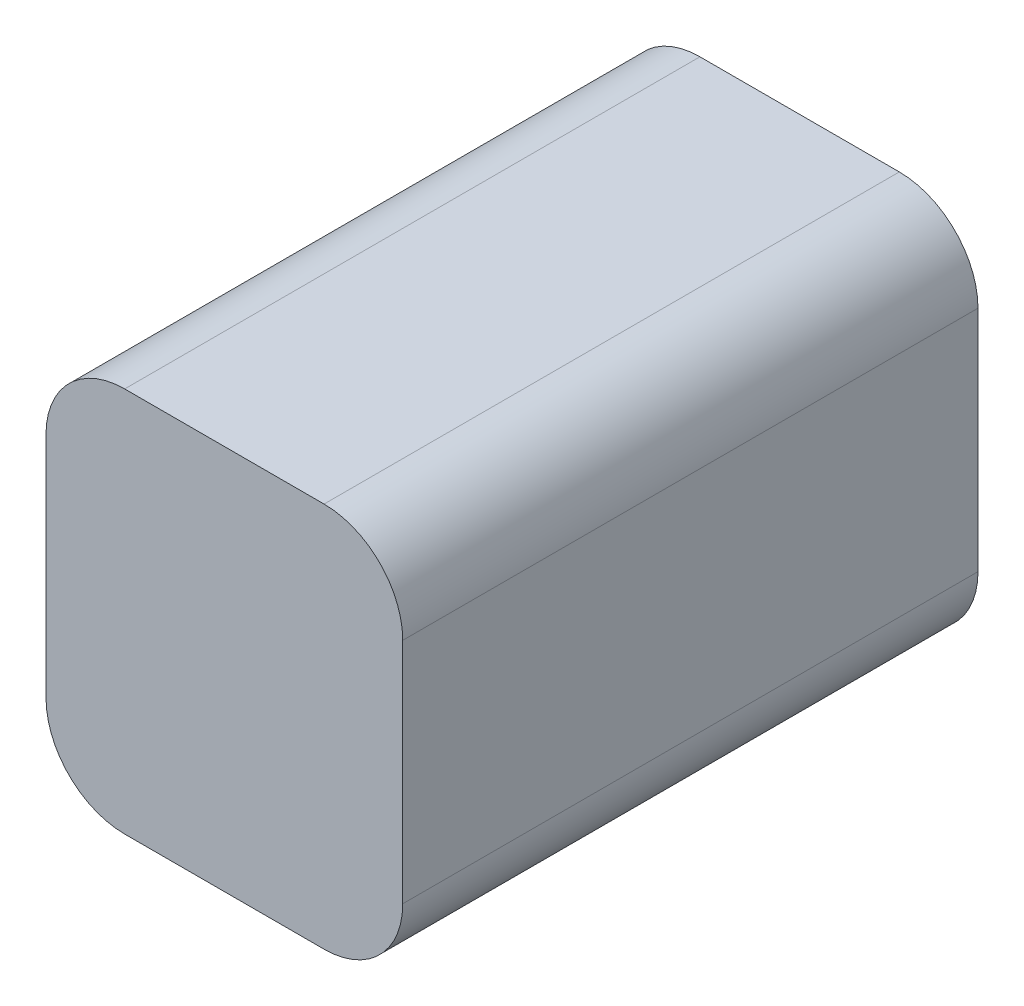
ISO-10303-21;
HEADER;
FILE_DESCRIPTION(('STEP AP214'),'2;1');
FILE_NAME('part.step','',(''),(''),'','','');
FILE_SCHEMA(('AUTOMOTIVE_DESIGN { 1 0 10303 214 1 1 1 1 }'));
ENDSEC;
DATA;
#1=APPLICATION_CONTEXT('core data for automotive mechanical design processes');
#2=APPLICATION_PROTOCOL_DEFINITION('international standard','automotive_design',2000,#1);
#3=PRODUCT_CONTEXT('',#1,'mechanical');
#4=PRODUCT('Part','Part','',(#3));
#5=PRODUCT_RELATED_PRODUCT_CATEGORY('part','',(#4));
#6=PRODUCT_DEFINITION_FORMATION('','',#4);
#7=PRODUCT_DEFINITION_CONTEXT('part definition',#1,'design');
#8=PRODUCT_DEFINITION('design','',#6,#7);
#9=PRODUCT_DEFINITION_SHAPE('','',#8);
#10=(LENGTH_UNIT() NAMED_UNIT(*) SI_UNIT(.MILLI.,.METRE.));
#11=(NAMED_UNIT(*) PLANE_ANGLE_UNIT() SI_UNIT($,.RADIAN.));
#12=(NAMED_UNIT(*) SI_UNIT($,.STERADIAN.) SOLID_ANGLE_UNIT());
#13=UNCERTAINTY_MEASURE_WITH_UNIT(LENGTH_MEASURE(1.E-05),#10,'distance_accuracy_value','');
#14=(GEOMETRIC_REPRESENTATION_CONTEXT(3) GLOBAL_UNCERTAINTY_ASSIGNED_CONTEXT((#13)) GLOBAL_UNIT_ASSIGNED_CONTEXT((#10,
#11,#12)) REPRESENTATION_CONTEXT('',''));
#15=CARTESIAN_POINT('',(0.,0.,0.));
#16=DIRECTION('',(0.,0.,1.));
#17=DIRECTION('',(1.,0.,0.));
#18=AXIS2_PLACEMENT_3D('',#15,#16,#17);
#19=CARTESIAN_POINT('',(-19.39,22.78,68.));
#20=DIRECTION('',(0.,-1.,0.));
#21=DIRECTION('',(0.,0.,-1.));
#22=AXIS2_PLACEMENT_3D('',#19,#20,#21);
#23=PLANE('',#22);
#24=DIRECTION('',(-1.,0.,0.));
#25=VECTOR('',#24,1.);
#26=CARTESIAN_POINT('',(-19.39,22.78,0.));
#27=LINE('',#26,#25);
#28=CARTESIAN_POINT('',(13.48,22.78,0.));
#29=VERTEX_POINT('',#28);
#30=CARTESIAN_POINT('',(-10.09,22.78,0.));
#31=VERTEX_POINT('',#30);
#32=EDGE_CURVE('E146',#29,#31,#27,.T.);
#33=ORIENTED_EDGE('',*,*,#32,.T.);
#34=DIRECTION('',(0.,0.,-1.));
#35=VECTOR('',#34,1.);
#36=CARTESIAN_POINT('',(-10.09,22.78,68.));
#37=LINE('',#36,#35);
#38=CARTESIAN_POINT('',(-10.09,22.78,68.));
#39=VERTEX_POINT('',#38);
#40=EDGE_CURVE('E180',#31,#39,#37,.F.);
#41=ORIENTED_EDGE('',*,*,#40,.T.);
#42=DIRECTION('',(-1.,0.,0.));
#43=VECTOR('',#42,1.);
#44=CARTESIAN_POINT('',(-19.39,22.78,68.));
#45=LINE('',#44,#43);
#46=CARTESIAN_POINT('',(13.48,22.78,68.));
#47=VERTEX_POINT('',#46);
#48=EDGE_CURVE('E144',#47,#39,#45,.T.);
#49=ORIENTED_EDGE('',*,*,#48,.F.);
#50=DIRECTION('',(0.,0.,-1.));
#51=VECTOR('',#50,1.);
#52=CARTESIAN_POINT('',(13.48,22.78,68.));
#53=LINE('',#52,#51);
#54=EDGE_CURVE('E176',#47,#29,#53,.T.);
#55=ORIENTED_EDGE('',*,*,#54,.T.);
#56=EDGE_LOOP('',(#33,#41,#49,#55));
#57=FACE_BOUND('',#56,.T.);
#58=ADVANCED_FACE('F45',(#57),#23,.F.);
#59=CARTESIAN_POINT('',(-19.39,-22.79,68.));
#60=DIRECTION('',(1.,0.,0.));
#61=DIRECTION('',(0.,0.,-1.));
#62=AXIS2_PLACEMENT_3D('',#59,#60,#61);
#63=PLANE('',#62);
#64=DIRECTION('',(0.,-1.,0.));
#65=VECTOR('',#64,1.);
#66=CARTESIAN_POINT('',(-19.39,-22.79,0.));
#67=LINE('',#66,#65);
#68=CARTESIAN_POINT('',(-19.39,13.48,0.));
#69=VERTEX_POINT('',#68);
#70=CARTESIAN_POINT('',(-19.39,-13.49,0.));
#71=VERTEX_POINT('',#70);
#72=EDGE_CURVE('E140',#69,#71,#67,.T.);
#73=ORIENTED_EDGE('',*,*,#72,.T.);
#74=DIRECTION('',(0.,0.,-1.));
#75=VECTOR('',#74,1.);
#76=CARTESIAN_POINT('',(-19.39,-13.49,68.));
#77=LINE('',#76,#75);
#78=CARTESIAN_POINT('',(-19.39,-13.49,68.));
#79=VERTEX_POINT('',#78);
#80=EDGE_CURVE('E116',#71,#79,#77,.F.);
#81=ORIENTED_EDGE('',*,*,#80,.T.);
#82=DIRECTION('',(0.,-1.,0.));
#83=VECTOR('',#82,1.);
#84=CARTESIAN_POINT('',(-19.39,-22.79,68.));
#85=LINE('',#84,#83);
#86=CARTESIAN_POINT('',(-19.39,13.48,68.));
#87=VERTEX_POINT('',#86);
#88=EDGE_CURVE('E199',#87,#79,#85,.T.);
#89=ORIENTED_EDGE('',*,*,#88,.F.);
#90=DIRECTION('',(0.,0.,-1.));
#91=VECTOR('',#90,1.);
#92=CARTESIAN_POINT('',(-19.39,13.48,68.));
#93=LINE('',#92,#91);
#94=EDGE_CURVE('E122',#87,#69,#93,.T.);
#95=ORIENTED_EDGE('',*,*,#94,.T.);
#96=EDGE_LOOP('',(#73,#81,#89,#95));
#97=FACE_BOUND('',#96,.T.);
#98=ADVANCED_FACE('F220',(#97),#63,.F.);
#99=CARTESIAN_POINT('',(22.78,-22.79,68.));
#100=DIRECTION('',(0.,1.,0.));
#101=DIRECTION('',(-1.,0.,0.));
#102=AXIS2_PLACEMENT_3D('',#99,#100,#101);
#103=PLANE('',#102);
#104=DIRECTION('',(1.,0.,0.));
#105=VECTOR('',#104,1.);
#106=CARTESIAN_POINT('',(22.78,-22.79,68.));
#107=LINE('',#106,#105);
#108=CARTESIAN_POINT('',(-10.09,-22.79,68.));
#109=VERTEX_POINT('',#108);
#110=CARTESIAN_POINT('',(13.48,-22.79,68.));
#111=VERTEX_POINT('',#110);
#112=EDGE_CURVE('E131',#109,#111,#107,.T.);
#113=ORIENTED_EDGE('',*,*,#112,.F.);
#114=DIRECTION('',(0.,0.,-1.));
#115=VECTOR('',#114,1.);
#116=CARTESIAN_POINT('',(-10.09,-22.79,68.));
#117=LINE('',#116,#115);
#118=CARTESIAN_POINT('',(-10.09,-22.79,0.));
#119=VERTEX_POINT('',#118);
#120=EDGE_CURVE('E115',#109,#119,#117,.T.);
#121=ORIENTED_EDGE('',*,*,#120,.T.);
#122=DIRECTION('',(1.,0.,0.));
#123=VECTOR('',#122,1.);
#124=CARTESIAN_POINT('',(22.78,-22.79,0.));
#125=LINE('',#124,#123);
#126=CARTESIAN_POINT('',(13.48,-22.79,0.));
#127=VERTEX_POINT('',#126);
#128=EDGE_CURVE('E129',#119,#127,#125,.T.);
#129=ORIENTED_EDGE('',*,*,#128,.T.);
#130=DIRECTION('',(0.,0.,-1.));
#131=VECTOR('',#130,1.);
#132=CARTESIAN_POINT('',(13.48,-22.79,68.));
#133=LINE('',#132,#131);
#134=EDGE_CURVE('E134',#127,#111,#133,.F.);
#135=ORIENTED_EDGE('',*,*,#134,.T.);
#136=EDGE_LOOP('',(#113,#121,#129,#135));
#137=FACE_BOUND('',#136,.T.);
#138=ADVANCED_FACE('F128',(#137),#103,.F.);
#139=CARTESIAN_POINT('',(22.78,22.78,68.));
#140=DIRECTION('',(-1.,0.,0.));
#141=DIRECTION('',(0.,-1.,0.));
#142=AXIS2_PLACEMENT_3D('',#139,#140,#141);
#143=PLANE('',#142);
#144=DIRECTION('',(0.,1.,0.));
#145=VECTOR('',#144,1.);
#146=CARTESIAN_POINT('',(22.78,22.78,0.));
#147=LINE('',#146,#145);
#148=CARTESIAN_POINT('',(22.78,-13.49,0.));
#149=VERTEX_POINT('',#148);
#150=CARTESIAN_POINT('',(22.78,13.48,0.));
#151=VERTEX_POINT('',#150);
#152=EDGE_CURVE('E139',#149,#151,#147,.T.);
#153=ORIENTED_EDGE('',*,*,#152,.T.);
#154=DIRECTION('',(0.,0.,-1.));
#155=VECTOR('',#154,1.);
#156=CARTESIAN_POINT('',(22.78,13.48,68.));
#157=LINE('',#156,#155);
#158=CARTESIAN_POINT('',(22.78,13.48,68.));
#159=VERTEX_POINT('',#158);
#160=EDGE_CURVE('E11',#151,#159,#157,.F.);
#161=ORIENTED_EDGE('',*,*,#160,.T.);
#162=DIRECTION('',(0.,1.,0.));
#163=VECTOR('',#162,1.);
#164=CARTESIAN_POINT('',(22.78,22.78,68.));
#165=LINE('',#164,#163);
#166=CARTESIAN_POINT('',(22.78,-13.49,68.));
#167=VERTEX_POINT('',#166);
#168=EDGE_CURVE('E151',#167,#159,#165,.T.);
#169=ORIENTED_EDGE('',*,*,#168,.F.);
#170=DIRECTION('',(0.,0.,-1.));
#171=VECTOR('',#170,1.);
#172=CARTESIAN_POINT('',(22.78,-13.49,68.));
#173=LINE('',#172,#171);
#174=EDGE_CURVE('E54',#167,#149,#173,.T.);
#175=ORIENTED_EDGE('',*,*,#174,.T.);
#176=EDGE_LOOP('',(#153,#161,#169,#175));
#177=FACE_BOUND('',#176,.T.);
#178=ADVANCED_FACE('F185',(#177),#143,.F.);
#179=CARTESIAN_POINT('',(0.,0.,68.));
#180=DIRECTION('',(0.,0.,-1.));
#181=DIRECTION('',(-1.,0.,0.));
#182=AXIS2_PLACEMENT_3D('',#179,#180,#181);
#183=PLANE('',#182);
#184=ORIENTED_EDGE('',*,*,#88,.T.);
#185=CARTESIAN_POINT('',(-10.09,-13.49,68.));
#186=DIRECTION('',(0.,0.,-1.));
#187=DIRECTION('',(-1.,0.,0.));
#188=AXIS2_PLACEMENT_3D('',#185,#186,#187);
#189=CIRCLE('',#188,9.3);
#190=EDGE_CURVE('E173',#79,#109,#189,.F.);
#191=ORIENTED_EDGE('',*,*,#190,.T.);
#192=ORIENTED_EDGE('',*,*,#112,.T.);
#193=CARTESIAN_POINT('',(13.48,-13.49,68.));
#194=DIRECTION('',(0.,0.,-1.));
#195=DIRECTION('',(-1.,0.,0.));
#196=AXIS2_PLACEMENT_3D('',#193,#194,#195);
#197=CIRCLE('',#196,9.3);
#198=EDGE_CURVE('E66',#111,#167,#197,.F.);
#199=ORIENTED_EDGE('',*,*,#198,.T.);
#200=ORIENTED_EDGE('',*,*,#168,.T.);
#201=CARTESIAN_POINT('',(13.48,13.48,68.));
#202=DIRECTION('',(0.,0.,-1.));
#203=DIRECTION('',(-1.,0.,0.));
#204=AXIS2_PLACEMENT_3D('',#201,#202,#203);
#205=CIRCLE('',#204,9.3);
#206=EDGE_CURVE('E167',#159,#47,#205,.F.);
#207=ORIENTED_EDGE('',*,*,#206,.T.);
#208=ORIENTED_EDGE('',*,*,#48,.T.);
#209=CARTESIAN_POINT('',(-10.09,13.48,68.));
#210=DIRECTION('',(0.,0.,-1.));
#211=DIRECTION('',(-1.,0.,0.));
#212=AXIS2_PLACEMENT_3D('',#209,#210,#211);
#213=CIRCLE('',#212,9.3);
#214=EDGE_CURVE('E170',#39,#87,#213,.F.);
#215=ORIENTED_EDGE('',*,*,#214,.T.);
#216=EDGE_LOOP('',(#184,#191,#192,#199,#200,#207,#208,#215));
#217=FACE_BOUND('',#216,.T.);
#218=ADVANCED_FACE('F209',(#217),#183,.F.);
#219=CARTESIAN_POINT('',(0.,0.,0.));
#220=DIRECTION('',(0.,0.,-1.));
#221=DIRECTION('',(-1.,0.,0.));
#222=AXIS2_PLACEMENT_3D('',#219,#220,#221);
#223=PLANE('',#222);
#224=ORIENTED_EDGE('',*,*,#128,.F.);
#225=CARTESIAN_POINT('',(-10.09,-13.49,0.));
#226=DIRECTION('',(0.,0.,-1.));
#227=DIRECTION('',(-1.,0.,0.));
#228=AXIS2_PLACEMENT_3D('',#225,#226,#227);
#229=CIRCLE('',#228,9.3);
#230=EDGE_CURVE('E111',#119,#71,#229,.T.);
#231=ORIENTED_EDGE('',*,*,#230,.T.);
#232=ORIENTED_EDGE('',*,*,#72,.F.);
#233=CARTESIAN_POINT('',(-10.09,13.48,0.));
#234=DIRECTION('',(0.,0.,-1.));
#235=DIRECTION('',(-1.,0.,0.));
#236=AXIS2_PLACEMENT_3D('',#233,#234,#235);
#237=CIRCLE('',#236,9.3);
#238=EDGE_CURVE('E123',#69,#31,#237,.T.);
#239=ORIENTED_EDGE('',*,*,#238,.T.);
#240=ORIENTED_EDGE('',*,*,#32,.F.);
#241=CARTESIAN_POINT('',(13.48,13.48,0.));
#242=DIRECTION('',(0.,0.,-1.));
#243=DIRECTION('',(-1.,0.,0.));
#244=AXIS2_PLACEMENT_3D('',#241,#242,#243);
#245=CIRCLE('',#244,9.3);
#246=EDGE_CURVE('E155',#29,#151,#245,.T.);
#247=ORIENTED_EDGE('',*,*,#246,.T.);
#248=ORIENTED_EDGE('',*,*,#152,.F.);
#249=CARTESIAN_POINT('',(13.48,-13.49,0.));
#250=DIRECTION('',(0.,0.,-1.));
#251=DIRECTION('',(-1.,0.,0.));
#252=AXIS2_PLACEMENT_3D('',#249,#250,#251);
#253=CIRCLE('',#252,9.3);
#254=EDGE_CURVE('E133',#149,#127,#253,.T.);
#255=ORIENTED_EDGE('',*,*,#254,.T.);
#256=EDGE_LOOP('',(#224,#231,#232,#239,#240,#247,#248,#255));
#257=FACE_BOUND('',#256,.T.);
#258=ADVANCED_FACE('F136',(#257),#223,.T.);
#259=CARTESIAN_POINT('',(-10.09,-13.49,68.));
#260=DIRECTION('',(0.,0.,-1.));
#261=DIRECTION('',(-1.,0.,0.));
#262=AXIS2_PLACEMENT_3D('',#259,#260,#261);
#263=CYLINDRICAL_SURFACE('',#262,9.3);
#264=ORIENTED_EDGE('',*,*,#190,.F.);
#265=ORIENTED_EDGE('',*,*,#80,.F.);
#266=ORIENTED_EDGE('',*,*,#230,.F.);
#267=ORIENTED_EDGE('',*,*,#120,.F.);
#268=EDGE_LOOP('',(#264,#265,#266,#267));
#269=FACE_BOUND('',#268,.T.);
#270=ADVANCED_FACE('F114',(#269),#263,.T.);
#271=CARTESIAN_POINT('',(-10.09,13.48,68.));
#272=DIRECTION('',(0.,0.,-1.));
#273=DIRECTION('',(-1.,0.,0.));
#274=AXIS2_PLACEMENT_3D('',#271,#272,#273);
#275=CYLINDRICAL_SURFACE('',#274,9.3);
#276=ORIENTED_EDGE('',*,*,#214,.F.);
#277=ORIENTED_EDGE('',*,*,#40,.F.);
#278=ORIENTED_EDGE('',*,*,#238,.F.);
#279=ORIENTED_EDGE('',*,*,#94,.F.);
#280=EDGE_LOOP('',(#276,#277,#278,#279));
#281=FACE_BOUND('',#280,.T.);
#282=ADVANCED_FACE('F231',(#281),#275,.T.);
#283=CARTESIAN_POINT('',(13.48,13.48,68.));
#284=DIRECTION('',(0.,0.,-1.));
#285=DIRECTION('',(-1.,0.,0.));
#286=AXIS2_PLACEMENT_3D('',#283,#284,#285);
#287=CYLINDRICAL_SURFACE('',#286,9.3);
#288=ORIENTED_EDGE('',*,*,#206,.F.);
#289=ORIENTED_EDGE('',*,*,#160,.F.);
#290=ORIENTED_EDGE('',*,*,#246,.F.);
#291=ORIENTED_EDGE('',*,*,#54,.F.);
#292=EDGE_LOOP('',(#288,#289,#290,#291));
#293=FACE_BOUND('',#292,.T.);
#294=ADVANCED_FACE('F192',(#293),#287,.T.);
#295=CARTESIAN_POINT('',(13.48,-13.49,68.));
#296=DIRECTION('',(0.,0.,-1.));
#297=DIRECTION('',(-1.,0.,0.));
#298=AXIS2_PLACEMENT_3D('',#295,#296,#297);
#299=CYLINDRICAL_SURFACE('',#298,9.3);
#300=ORIENTED_EDGE('',*,*,#198,.F.);
#301=ORIENTED_EDGE('',*,*,#134,.F.);
#302=ORIENTED_EDGE('',*,*,#254,.F.);
#303=ORIENTED_EDGE('',*,*,#174,.F.);
#304=EDGE_LOOP('',(#300,#301,#302,#303));
#305=FACE_BOUND('',#304,.T.);
#306=ADVANCED_FACE('F47',(#305),#299,.T.);
#307=CLOSED_SHELL('',(#58,#98,#138,#178,#218,#258,#270,#282,#294,#306));
#308=MANIFOLD_SOLID_BREP('B2',#307);
#309=ADVANCED_BREP_SHAPE_REPRESENTATION('',(#18,#308),#14);
#310=SHAPE_DEFINITION_REPRESENTATION(#9,#309);
ENDSEC;
END-ISO-10303-21;
